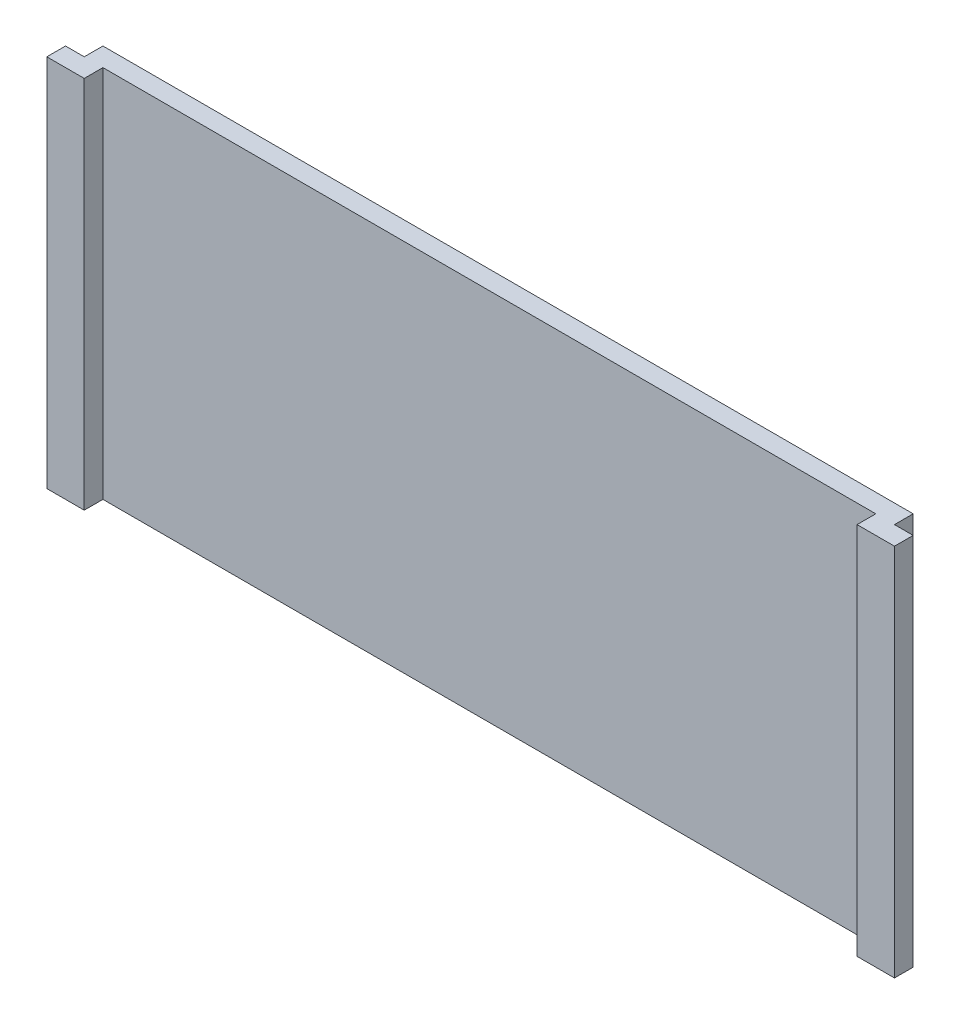
ISO-10303-21;
HEADER;
FILE_DESCRIPTION(('STEP AP214'),'2;1');
FILE_NAME('part.step','',(''),(''),'','','');
FILE_SCHEMA(('AUTOMOTIVE_DESIGN { 1 0 10303 214 1 1 1 1 }'));
ENDSEC;
DATA;
#1=APPLICATION_CONTEXT('core data for automotive mechanical design processes');
#2=APPLICATION_PROTOCOL_DEFINITION('international standard','automotive_design',2000,#1);
#3=PRODUCT_CONTEXT('',#1,'mechanical');
#4=PRODUCT('Part','Part','',(#3));
#5=PRODUCT_RELATED_PRODUCT_CATEGORY('part','',(#4));
#6=PRODUCT_DEFINITION_FORMATION('','',#4);
#7=PRODUCT_DEFINITION_CONTEXT('part definition',#1,'design');
#8=PRODUCT_DEFINITION('design','',#6,#7);
#9=PRODUCT_DEFINITION_SHAPE('','',#8);
#10=(LENGTH_UNIT() NAMED_UNIT(*) SI_UNIT(.MILLI.,.METRE.));
#11=(NAMED_UNIT(*) PLANE_ANGLE_UNIT() SI_UNIT($,.RADIAN.));
#12=(NAMED_UNIT(*) SI_UNIT($,.STERADIAN.) SOLID_ANGLE_UNIT());
#13=UNCERTAINTY_MEASURE_WITH_UNIT(LENGTH_MEASURE(1.E-05),#10,'distance_accuracy_value','');
#14=(GEOMETRIC_REPRESENTATION_CONTEXT(3) GLOBAL_UNCERTAINTY_ASSIGNED_CONTEXT((#13)) GLOBAL_UNIT_ASSIGNED_CONTEXT((#10,
#11,#12)) REPRESENTATION_CONTEXT('',''));
#15=CARTESIAN_POINT('',(0.,0.,0.));
#16=DIRECTION('',(0.,0.,1.));
#17=DIRECTION('',(1.,0.,0.));
#18=AXIS2_PLACEMENT_3D('',#15,#16,#17);
#19=CARTESIAN_POINT('',(0.,0.,3.));
#20=DIRECTION('',(0.,0.,1.));
#21=DIRECTION('',(1.,0.,0.));
#22=AXIS2_PLACEMENT_3D('',#19,#20,#21);
#23=PLANE('',#22);
#24=DIRECTION('',(1.,0.,0.));
#25=VECTOR('',#24,1.);
#26=CARTESIAN_POINT('',(-13.7646933247942,-11.2650602409639,3.));
#27=LINE('',#26,#25);
#28=CARTESIAN_POINT('',(-10.7646933247942,-11.2650602409639,3.));
#29=VERTEX_POINT('',#28);
#30=CARTESIAN_POINT('',(113.235306675206,-11.2650602409639,3.));
#31=VERTEX_POINT('',#30);
#32=EDGE_CURVE('E57',#29,#31,#27,.T.);
#33=ORIENTED_EDGE('',*,*,#32,.T.);
#34=DIRECTION('',(0.,-1.,0.));
#35=VECTOR('',#34,1.);
#36=CARTESIAN_POINT('',(113.235306675206,0.,3.));
#37=LINE('',#36,#35);
#38=CARTESIAN_POINT('',(113.235306675206,48.7349397590361,3.));
#39=VERTEX_POINT('',#38);
#40=EDGE_CURVE('E175',#39,#31,#37,.T.);
#41=ORIENTED_EDGE('',*,*,#40,.F.);
#42=DIRECTION('',(-1.,0.,0.));
#43=VECTOR('',#42,1.);
#44=CARTESIAN_POINT('',(-13.7646933247942,48.7349397590361,3.));
#45=LINE('',#44,#43);
#46=CARTESIAN_POINT('',(-10.7646933247942,48.7349397590361,3.));
#47=VERTEX_POINT('',#46);
#48=EDGE_CURVE('E239',#39,#47,#45,.T.);
#49=ORIENTED_EDGE('',*,*,#48,.T.);
#50=DIRECTION('',(0.,-1.,0.));
#51=VECTOR('',#50,1.);
#52=CARTESIAN_POINT('',(-10.7646933247942,0.,3.));
#53=LINE('',#52,#51);
#54=EDGE_CURVE('E210',#47,#29,#53,.T.);
#55=ORIENTED_EDGE('',*,*,#54,.T.);
#56=EDGE_LOOP('',(#33,#41,#49,#55));
#57=FACE_BOUND('',#56,.T.);
#58=ADVANCED_FACE('F41',(#57),#23,.T.);
#59=CARTESIAN_POINT('',(-13.7646933247942,48.7349397590361,3.));
#60=DIRECTION('',(1.,0.,0.));
#61=DIRECTION('',(0.,1.,0.));
#62=AXIS2_PLACEMENT_3D('',#59,#60,#61);
#63=PLANE('',#62);
#64=DIRECTION('',(0.,-1.,0.));
#65=VECTOR('',#64,1.);
#66=CARTESIAN_POINT('',(-13.7646933247942,48.7349397590361,0.));
#67=LINE('',#66,#65);
#68=CARTESIAN_POINT('',(-13.7646933247942,48.7349397590361,0.));
#69=VERTEX_POINT('',#68);
#70=CARTESIAN_POINT('',(-13.7646933247942,-11.2650602409639,0.));
#71=VERTEX_POINT('',#70);
#72=EDGE_CURVE('E228',#69,#71,#67,.T.);
#73=ORIENTED_EDGE('',*,*,#72,.T.);
#74=DIRECTION('',(0.,0.,-1.));
#75=VECTOR('',#74,1.);
#76=CARTESIAN_POINT('',(-13.7646933247942,-11.2650602409639,3.));
#77=LINE('',#76,#75);
#78=CARTESIAN_POINT('',(-13.7646933247942,-11.2650602409639,3.));
#79=VERTEX_POINT('',#78);
#80=EDGE_CURVE('E11',#79,#71,#77,.T.);
#81=ORIENTED_EDGE('',*,*,#80,.F.);
#82=DIRECTION('',(0.,-1.,0.));
#83=VECTOR('',#82,1.);
#84=CARTESIAN_POINT('',(-13.7646933247942,48.7349397590361,3.));
#85=LINE('',#84,#83);
#86=CARTESIAN_POINT('',(-13.7646933247942,48.7349397590361,3.));
#87=VERTEX_POINT('',#86);
#88=EDGE_CURVE('E229',#87,#79,#85,.T.);
#89=ORIENTED_EDGE('',*,*,#88,.F.);
#90=DIRECTION('',(0.,0.,-1.));
#91=VECTOR('',#90,1.);
#92=CARTESIAN_POINT('',(-13.7646933247942,48.7349397590361,3.));
#93=LINE('',#92,#91);
#94=EDGE_CURVE('E242',#87,#69,#93,.T.);
#95=ORIENTED_EDGE('',*,*,#94,.T.);
#96=EDGE_LOOP('',(#73,#81,#89,#95));
#97=FACE_BOUND('',#96,.T.);
#98=ADVANCED_FACE('F43',(#97),#63,.F.);
#99=CARTESIAN_POINT('',(-13.7646933247942,-11.2650602409639,3.));
#100=DIRECTION('',(0.,1.,0.));
#101=DIRECTION('',(0.,0.,1.));
#102=AXIS2_PLACEMENT_3D('',#99,#100,#101);
#103=PLANE('',#102);
#104=DIRECTION('',(1.,0.,0.));
#105=VECTOR('',#104,1.);
#106=CARTESIAN_POINT('',(-13.7646933247942,-11.2650602409639,0.));
#107=LINE('',#106,#105);
#108=CARTESIAN_POINT('',(116.235306675206,-11.2650602409639,0.));
#109=VERTEX_POINT('',#108);
#110=EDGE_CURVE('E246',#71,#109,#107,.T.);
#111=ORIENTED_EDGE('',*,*,#110,.T.);
#112=DIRECTION('',(0.,0.,-1.));
#113=VECTOR('',#112,1.);
#114=CARTESIAN_POINT('',(116.235306675206,-11.2650602409639,3.));
#115=LINE('',#114,#113);
#116=CARTESIAN_POINT('',(116.235306675206,-11.2650602409639,3.));
#117=VERTEX_POINT('',#116);
#118=EDGE_CURVE('E50',#117,#109,#115,.T.);
#119=ORIENTED_EDGE('',*,*,#118,.F.);
#120=DIRECTION('',(1.,0.,0.));
#121=VECTOR('',#120,1.);
#122=CARTESIAN_POINT('',(0.,-11.2650602409639,3.));
#123=LINE('',#122,#121);
#124=CARTESIAN_POINT('',(119.235306675206,-11.2650602409638,3.));
#125=VERTEX_POINT('',#124);
#126=EDGE_CURVE('E156',#117,#125,#123,.T.);
#127=ORIENTED_EDGE('',*,*,#126,.T.);
#128=DIRECTION('',(0.,0.,-1.));
#129=VECTOR('',#128,1.);
#130=CARTESIAN_POINT('',(119.235306675206,-11.2650602409638,6.));
#131=LINE('',#130,#129);
#132=CARTESIAN_POINT('',(119.235306675206,-11.2650602409638,6.));
#133=VERTEX_POINT('',#132);
#134=EDGE_CURVE('E169',#133,#125,#131,.T.);
#135=ORIENTED_EDGE('',*,*,#134,.F.);
#136=DIRECTION('',(1.,0.,0.));
#137=VECTOR('',#136,1.);
#138=CARTESIAN_POINT('',(0.,-11.2650602409639,6.));
#139=LINE('',#138,#137);
#140=CARTESIAN_POINT('',(113.235306675206,-11.2650602409639,6.));
#141=VERTEX_POINT('',#140);
#142=EDGE_CURVE('E153',#141,#133,#139,.T.);
#143=ORIENTED_EDGE('',*,*,#142,.F.);
#144=DIRECTION('',(0.,0.,-1.));
#145=VECTOR('',#144,1.);
#146=CARTESIAN_POINT('',(113.235306675206,-11.2650602409639,6.));
#147=LINE('',#146,#145);
#148=EDGE_CURVE('E182',#141,#31,#147,.T.);
#149=ORIENTED_EDGE('',*,*,#148,.T.);
#150=ORIENTED_EDGE('',*,*,#32,.F.);
#151=DIRECTION('',(0.,0.,-1.));
#152=VECTOR('',#151,1.);
#153=CARTESIAN_POINT('',(-10.7646933247942,-11.2650602409639,6.));
#154=LINE('',#153,#152);
#155=CARTESIAN_POINT('',(-10.7646933247942,-11.2650602409639,6.));
#156=VERTEX_POINT('',#155);
#157=EDGE_CURVE('E65',#156,#29,#154,.T.);
#158=ORIENTED_EDGE('',*,*,#157,.F.);
#159=DIRECTION('',(-1.,0.,0.));
#160=VECTOR('',#159,1.);
#161=CARTESIAN_POINT('',(0.,-11.2650602409639,6.));
#162=LINE('',#161,#160);
#163=CARTESIAN_POINT('',(-16.7646933247942,-11.2650602409639,6.));
#164=VERTEX_POINT('',#163);
#165=EDGE_CURVE('E192',#156,#164,#162,.T.);
#166=ORIENTED_EDGE('',*,*,#165,.T.);
#167=DIRECTION('',(0.,0.,-1.));
#168=VECTOR('',#167,1.);
#169=CARTESIAN_POINT('',(-16.7646933247942,-11.2650602409639,6.));
#170=LINE('',#169,#168);
#171=CARTESIAN_POINT('',(-16.7646933247942,-11.2650602409639,3.));
#172=VERTEX_POINT('',#171);
#173=EDGE_CURVE('E224',#164,#172,#170,.T.);
#174=ORIENTED_EDGE('',*,*,#173,.T.);
#175=DIRECTION('',(-1.,0.,0.));
#176=VECTOR('',#175,1.);
#177=CARTESIAN_POINT('',(0.,-11.2650602409639,3.));
#178=LINE('',#177,#176);
#179=EDGE_CURVE('E207',#79,#172,#178,.T.);
#180=ORIENTED_EDGE('',*,*,#179,.F.);
#181=ORIENTED_EDGE('',*,*,#80,.T.);
#182=EDGE_LOOP('',(#111,#119,#127,#135,#143,#149,#150,#158,#166,#174,#180,#181));
#183=FACE_BOUND('',#182,.T.);
#184=ADVANCED_FACE('F279',(#183),#103,.F.);
#185=CARTESIAN_POINT('',(116.235306675206,48.7349397590361,3.));
#186=DIRECTION('',(-1.,0.,0.));
#187=DIRECTION('',(0.,-1.,0.));
#188=AXIS2_PLACEMENT_3D('',#185,#186,#187);
#189=PLANE('',#188);
#190=DIRECTION('',(0.,1.,0.));
#191=VECTOR('',#190,1.);
#192=CARTESIAN_POINT('',(116.235306675206,48.7349397590361,0.));
#193=LINE('',#192,#191);
#194=CARTESIAN_POINT('',(116.235306675206,48.7349397590361,0.));
#195=VERTEX_POINT('',#194);
#196=EDGE_CURVE('E249',#109,#195,#193,.T.);
#197=ORIENTED_EDGE('',*,*,#196,.T.);
#198=DIRECTION('',(0.,0.,-1.));
#199=VECTOR('',#198,1.);
#200=CARTESIAN_POINT('',(116.235306675206,48.7349397590361,3.));
#201=LINE('',#200,#199);
#202=CARTESIAN_POINT('',(116.235306675206,48.7349397590361,3.));
#203=VERTEX_POINT('',#202);
#204=EDGE_CURVE('E257',#203,#195,#201,.T.);
#205=ORIENTED_EDGE('',*,*,#204,.F.);
#206=DIRECTION('',(0.,1.,0.));
#207=VECTOR('',#206,1.);
#208=CARTESIAN_POINT('',(116.235306675206,48.7349397590361,3.));
#209=LINE('',#208,#207);
#210=EDGE_CURVE('E235',#117,#203,#209,.T.);
#211=ORIENTED_EDGE('',*,*,#210,.F.);
#212=ORIENTED_EDGE('',*,*,#118,.T.);
#213=EDGE_LOOP('',(#197,#205,#211,#212));
#214=FACE_BOUND('',#213,.T.);
#215=ADVANCED_FACE('F265',(#214),#189,.F.);
#216=CARTESIAN_POINT('',(-13.7646933247942,48.7349397590361,3.));
#217=DIRECTION('',(0.,-1.,0.));
#218=DIRECTION('',(0.,0.,-1.));
#219=AXIS2_PLACEMENT_3D('',#216,#217,#218);
#220=PLANE('',#219);
#221=DIRECTION('',(-1.,0.,0.));
#222=VECTOR('',#221,1.);
#223=CARTESIAN_POINT('',(-13.7646933247942,48.7349397590361,0.));
#224=LINE('',#223,#222);
#225=EDGE_CURVE('E232',#195,#69,#224,.T.);
#226=ORIENTED_EDGE('',*,*,#225,.T.);
#227=ORIENTED_EDGE('',*,*,#94,.F.);
#228=DIRECTION('',(-1.,0.,0.));
#229=VECTOR('',#228,1.);
#230=CARTESIAN_POINT('',(0.,48.7349397590361,3.));
#231=LINE('',#230,#229);
#232=CARTESIAN_POINT('',(-16.7646933247942,48.7349397590361,3.));
#233=VERTEX_POINT('',#232);
#234=EDGE_CURVE('E193',#87,#233,#231,.T.);
#235=ORIENTED_EDGE('',*,*,#234,.T.);
#236=DIRECTION('',(0.,0.,-1.));
#237=VECTOR('',#236,1.);
#238=CARTESIAN_POINT('',(-16.7646933247942,48.7349397590361,6.));
#239=LINE('',#238,#237);
#240=CARTESIAN_POINT('',(-16.7646933247942,48.7349397590361,6.));
#241=VERTEX_POINT('',#240);
#242=EDGE_CURVE('E203',#241,#233,#239,.T.);
#243=ORIENTED_EDGE('',*,*,#242,.F.);
#244=DIRECTION('',(-1.,0.,0.));
#245=VECTOR('',#244,1.);
#246=CARTESIAN_POINT('',(0.,48.7349397590361,6.));
#247=LINE('',#246,#245);
#248=CARTESIAN_POINT('',(-10.7646933247942,48.7349397590361,6.));
#249=VERTEX_POINT('',#248);
#250=EDGE_CURVE('E200',#249,#241,#247,.T.);
#251=ORIENTED_EDGE('',*,*,#250,.F.);
#252=DIRECTION('',(0.,0.,-1.));
#253=VECTOR('',#252,1.);
#254=CARTESIAN_POINT('',(-10.7646933247942,48.7349397590361,6.));
#255=LINE('',#254,#253);
#256=EDGE_CURVE('E218',#249,#47,#255,.T.);
#257=ORIENTED_EDGE('',*,*,#256,.T.);
#258=ORIENTED_EDGE('',*,*,#48,.F.);
#259=DIRECTION('',(0.,0.,-1.));
#260=VECTOR('',#259,1.);
#261=CARTESIAN_POINT('',(113.235306675206,48.7349397590361,6.));
#262=LINE('',#261,#260);
#263=CARTESIAN_POINT('',(113.235306675206,48.7349397590361,6.));
#264=VERTEX_POINT('',#263);
#265=EDGE_CURVE('E146',#264,#39,#262,.T.);
#266=ORIENTED_EDGE('',*,*,#265,.F.);
#267=DIRECTION('',(1.,0.,0.));
#268=VECTOR('',#267,1.);
#269=CARTESIAN_POINT('',(0.,48.7349397590361,6.));
#270=LINE('',#269,#268);
#271=CARTESIAN_POINT('',(119.235306675206,48.7349397590361,6.));
#272=VERTEX_POINT('',#271);
#273=EDGE_CURVE('E151',#264,#272,#270,.T.);
#274=ORIENTED_EDGE('',*,*,#273,.T.);
#275=DIRECTION('',(0.,0.,-1.));
#276=VECTOR('',#275,1.);
#277=CARTESIAN_POINT('',(119.235306675206,48.7349397590361,6.));
#278=LINE('',#277,#276);
#279=CARTESIAN_POINT('',(119.235306675206,48.7349397590361,3.));
#280=VERTEX_POINT('',#279);
#281=EDGE_CURVE('E134',#272,#280,#278,.T.);
#282=ORIENTED_EDGE('',*,*,#281,.T.);
#283=DIRECTION('',(1.,0.,0.));
#284=VECTOR('',#283,1.);
#285=CARTESIAN_POINT('',(0.,48.7349397590361,3.));
#286=LINE('',#285,#284);
#287=EDGE_CURVE('E172',#203,#280,#286,.T.);
#288=ORIENTED_EDGE('',*,*,#287,.F.);
#289=ORIENTED_EDGE('',*,*,#204,.T.);
#290=EDGE_LOOP('',(#226,#227,#235,#243,#251,#257,#258,#266,#274,#282,#288,#289));
#291=FACE_BOUND('',#290,.T.);
#292=ADVANCED_FACE('F158',(#291),#220,.F.);
#293=CARTESIAN_POINT('',(0.,0.,0.));
#294=DIRECTION('',(0.,0.,1.));
#295=DIRECTION('',(1.,0.,0.));
#296=AXIS2_PLACEMENT_3D('',#293,#294,#295);
#297=PLANE('',#296);
#298=ORIENTED_EDGE('',*,*,#72,.F.);
#299=ORIENTED_EDGE('',*,*,#225,.F.);
#300=ORIENTED_EDGE('',*,*,#196,.F.);
#301=ORIENTED_EDGE('',*,*,#110,.F.);
#302=EDGE_LOOP('',(#298,#299,#300,#301));
#303=FACE_BOUND('',#302,.T.);
#304=ADVANCED_FACE('F271',(#303),#297,.F.);
#305=CARTESIAN_POINT('',(0.,0.,3.));
#306=DIRECTION('',(0.,0.,1.));
#307=DIRECTION('',(1.,0.,0.));
#308=AXIS2_PLACEMENT_3D('',#305,#306,#307);
#309=PLANE('',#308);
#310=ORIENTED_EDGE('',*,*,#234,.F.);
#311=ORIENTED_EDGE('',*,*,#88,.T.);
#312=ORIENTED_EDGE('',*,*,#179,.T.);
#313=DIRECTION('',(0.,1.,0.));
#314=VECTOR('',#313,1.);
#315=CARTESIAN_POINT('',(-16.7646933247942,0.,3.));
#316=LINE('',#315,#314);
#317=EDGE_CURVE('E145',#172,#233,#316,.T.);
#318=ORIENTED_EDGE('',*,*,#317,.T.);
#319=EDGE_LOOP('',(#310,#311,#312,#318));
#320=FACE_BOUND('',#319,.T.);
#321=ADVANCED_FACE('F278',(#320),#309,.F.);
#322=CARTESIAN_POINT('',(-16.7646933247942,0.,6.));
#323=DIRECTION('',(-1.,0.,0.));
#324=DIRECTION('',(0.,-1.,0.));
#325=AXIS2_PLACEMENT_3D('',#322,#323,#324);
#326=PLANE('',#325);
#327=ORIENTED_EDGE('',*,*,#317,.F.);
#328=ORIENTED_EDGE('',*,*,#173,.F.);
#329=DIRECTION('',(0.,1.,0.));
#330=VECTOR('',#329,1.);
#331=CARTESIAN_POINT('',(-16.7646933247942,0.,6.));
#332=LINE('',#331,#330);
#333=EDGE_CURVE('E188',#164,#241,#332,.T.);
#334=ORIENTED_EDGE('',*,*,#333,.T.);
#335=ORIENTED_EDGE('',*,*,#242,.T.);
#336=EDGE_LOOP('',(#327,#328,#334,#335));
#337=FACE_BOUND('',#336,.T.);
#338=ADVANCED_FACE('F284',(#337),#326,.T.);
#339=CARTESIAN_POINT('',(-10.7646933247942,0.,6.));
#340=DIRECTION('',(1.,0.,0.));
#341=DIRECTION('',(0.,1.,0.));
#342=AXIS2_PLACEMENT_3D('',#339,#340,#341);
#343=PLANE('',#342);
#344=ORIENTED_EDGE('',*,*,#54,.F.);
#345=ORIENTED_EDGE('',*,*,#256,.F.);
#346=DIRECTION('',(0.,-1.,0.));
#347=VECTOR('',#346,1.);
#348=CARTESIAN_POINT('',(-10.7646933247942,0.,6.));
#349=LINE('',#348,#347);
#350=EDGE_CURVE('E197',#249,#156,#349,.T.);
#351=ORIENTED_EDGE('',*,*,#350,.T.);
#352=ORIENTED_EDGE('',*,*,#157,.T.);
#353=EDGE_LOOP('',(#344,#345,#351,#352));
#354=FACE_BOUND('',#353,.T.);
#355=ADVANCED_FACE('F290',(#354),#343,.T.);
#356=CARTESIAN_POINT('',(0.,0.,6.));
#357=DIRECTION('',(0.,0.,1.));
#358=DIRECTION('',(1.,0.,0.));
#359=AXIS2_PLACEMENT_3D('',#356,#357,#358);
#360=PLANE('',#359);
#361=ORIENTED_EDGE('',*,*,#333,.F.);
#362=ORIENTED_EDGE('',*,*,#165,.F.);
#363=ORIENTED_EDGE('',*,*,#350,.F.);
#364=ORIENTED_EDGE('',*,*,#250,.T.);
#365=EDGE_LOOP('',(#361,#362,#363,#364));
#366=FACE_BOUND('',#365,.T.);
#367=ADVANCED_FACE('F289',(#366),#360,.T.);
#368=CARTESIAN_POINT('',(0.,0.,3.));
#369=DIRECTION('',(0.,0.,1.));
#370=DIRECTION('',(1.,0.,0.));
#371=AXIS2_PLACEMENT_3D('',#368,#369,#370);
#372=PLANE('',#371);
#373=ORIENTED_EDGE('',*,*,#126,.F.);
#374=ORIENTED_EDGE('',*,*,#210,.T.);
#375=ORIENTED_EDGE('',*,*,#287,.T.);
#376=DIRECTION('',(0.,-1.,0.));
#377=VECTOR('',#376,1.);
#378=CARTESIAN_POINT('',(119.235306675206,0.,3.));
#379=LINE('',#378,#377);
#380=EDGE_CURVE('E140',#280,#125,#379,.T.);
#381=ORIENTED_EDGE('',*,*,#380,.T.);
#382=EDGE_LOOP('',(#373,#374,#375,#381));
#383=FACE_BOUND('',#382,.T.);
#384=ADVANCED_FACE('F301',(#383),#372,.F.);
#385=CARTESIAN_POINT('',(119.235306675206,0.,6.));
#386=DIRECTION('',(1.,0.,0.));
#387=DIRECTION('',(0.,0.,-1.));
#388=AXIS2_PLACEMENT_3D('',#385,#386,#387);
#389=PLANE('',#388);
#390=ORIENTED_EDGE('',*,*,#380,.F.);
#391=ORIENTED_EDGE('',*,*,#281,.F.);
#392=DIRECTION('',(0.,-1.,0.));
#393=VECTOR('',#392,1.);
#394=CARTESIAN_POINT('',(119.235306675206,0.,6.));
#395=LINE('',#394,#393);
#396=EDGE_CURVE('E138',#272,#133,#395,.T.);
#397=ORIENTED_EDGE('',*,*,#396,.T.);
#398=ORIENTED_EDGE('',*,*,#134,.T.);
#399=EDGE_LOOP('',(#390,#391,#397,#398));
#400=FACE_BOUND('',#399,.T.);
#401=ADVANCED_FACE('F136',(#400),#389,.T.);
#402=CARTESIAN_POINT('',(113.235306675206,0.,6.));
#403=DIRECTION('',(1.,0.,0.));
#404=DIRECTION('',(0.,1.,0.));
#405=AXIS2_PLACEMENT_3D('',#402,#403,#404);
#406=PLANE('',#405);
#407=ORIENTED_EDGE('',*,*,#40,.T.);
#408=ORIENTED_EDGE('',*,*,#148,.F.);
#409=DIRECTION('',(0.,-1.,0.));
#410=VECTOR('',#409,1.);
#411=CARTESIAN_POINT('',(113.235306675206,0.,6.));
#412=LINE('',#411,#410);
#413=EDGE_CURVE('E162',#264,#141,#412,.T.);
#414=ORIENTED_EDGE('',*,*,#413,.F.);
#415=ORIENTED_EDGE('',*,*,#265,.T.);
#416=EDGE_LOOP('',(#407,#408,#414,#415));
#417=FACE_BOUND('',#416,.T.);
#418=ADVANCED_FACE('F293',(#417),#406,.F.);
#419=CARTESIAN_POINT('',(0.,0.,6.));
#420=DIRECTION('',(0.,0.,1.));
#421=DIRECTION('',(1.,0.,0.));
#422=AXIS2_PLACEMENT_3D('',#419,#420,#421);
#423=PLANE('',#422);
#424=ORIENTED_EDGE('',*,*,#396,.F.);
#425=ORIENTED_EDGE('',*,*,#273,.F.);
#426=ORIENTED_EDGE('',*,*,#413,.T.);
#427=ORIENTED_EDGE('',*,*,#142,.T.);
#428=EDGE_LOOP('',(#424,#425,#426,#427));
#429=FACE_BOUND('',#428,.T.);
#430=ADVANCED_FACE('F150',(#429),#423,.T.);
#431=CLOSED_SHELL('',(#58,#98,#184,#215,#292,#304,#321,#338,#355,#367,#384,#401,#418,#430));
#432=MANIFOLD_SOLID_BREP('B2',#431);
#433=ADVANCED_BREP_SHAPE_REPRESENTATION('',(#18,#432),#14);
#434=SHAPE_DEFINITION_REPRESENTATION(#9,#433);
ENDSEC;
END-ISO-10303-21;
